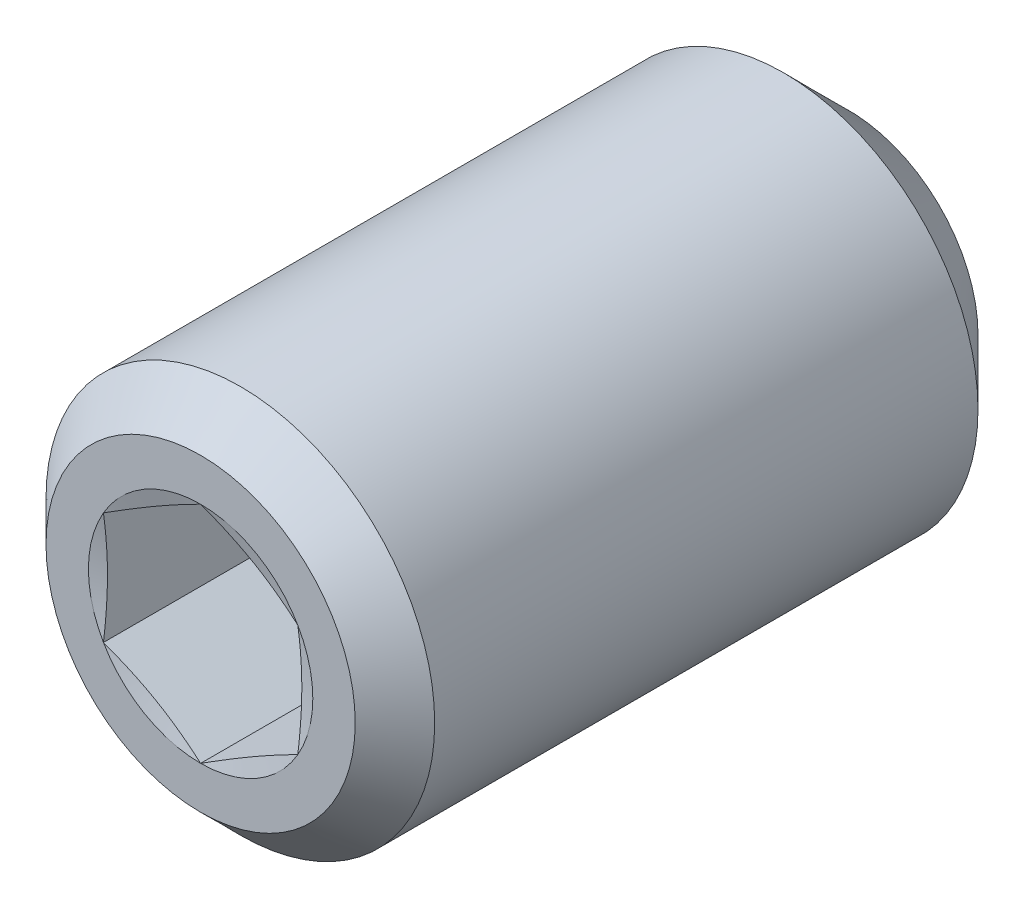
ISO-10303-21;
HEADER;
FILE_DESCRIPTION(('STEP AP214'),'2;1');
FILE_NAME('part.step','',(''),(''),'','','');
FILE_SCHEMA(('AUTOMOTIVE_DESIGN { 1 0 10303 214 1 1 1 1 }'));
ENDSEC;
DATA;
#1=APPLICATION_CONTEXT('core data for automotive mechanical design processes');
#2=APPLICATION_PROTOCOL_DEFINITION('international standard','automotive_design',2000,#1);
#3=PRODUCT_CONTEXT('',#1,'mechanical');
#4=PRODUCT('Part','Part','',(#3));
#5=PRODUCT_RELATED_PRODUCT_CATEGORY('part','',(#4));
#6=PRODUCT_DEFINITION_FORMATION('','',#4);
#7=PRODUCT_DEFINITION_CONTEXT('part definition',#1,'design');
#8=PRODUCT_DEFINITION('design','',#6,#7);
#9=PRODUCT_DEFINITION_SHAPE('','',#8);
#10=(LENGTH_UNIT() NAMED_UNIT(*) SI_UNIT(.MILLI.,.METRE.));
#11=(NAMED_UNIT(*) PLANE_ANGLE_UNIT() SI_UNIT($,.RADIAN.));
#12=(NAMED_UNIT(*) SI_UNIT($,.STERADIAN.) SOLID_ANGLE_UNIT());
#13=UNCERTAINTY_MEASURE_WITH_UNIT(LENGTH_MEASURE(1.E-05),#10,'distance_accuracy_value','');
#14=(GEOMETRIC_REPRESENTATION_CONTEXT(3) GLOBAL_UNCERTAINTY_ASSIGNED_CONTEXT((#13)) GLOBAL_UNIT_ASSIGNED_CONTEXT((#10,
#11,#12)) REPRESENTATION_CONTEXT('',''));
#15=CARTESIAN_POINT('',(0.,0.,0.));
#16=DIRECTION('',(0.,0.,1.));
#17=DIRECTION('',(1.,0.,0.));
#18=AXIS2_PLACEMENT_3D('',#15,#16,#17);
#19=CARTESIAN_POINT('',(0.,0.75,0.));
#20=DIRECTION('',(0.,0.,-1.));
#21=DIRECTION('',(-1.,0.,0.));
#22=AXIS2_PLACEMENT_3D('',#19,#20,#21);
#23=PLANE('',#22);
#24=CARTESIAN_POINT('',(0.,0.,0.));
#25=DIRECTION('',(0.,0.,1.));
#26=DIRECTION('',(1.,0.,0.));
#27=AXIS2_PLACEMENT_3D('',#24,#25,#26);
#28=CIRCLE('',#27,0.866025403784439);
#29=CARTESIAN_POINT('',(-0.75,-0.43301270189222,0.));
#30=VERTEX_POINT('',#29);
#31=CARTESIAN_POINT('',(0.,-0.866025403784439,0.));
#32=VERTEX_POINT('',#31);
#33=EDGE_CURVE('E156',#30,#32,#28,.T.);
#34=ORIENTED_EDGE('',*,*,#33,.F.);
#35=CARTESIAN_POINT('',(-0.75,0.433012701892219,0.));
#36=VERTEX_POINT('',#35);
#37=EDGE_CURVE('E155',#36,#30,#28,.T.);
#38=ORIENTED_EDGE('',*,*,#37,.F.);
#39=CARTESIAN_POINT('',(0.,0.866025403784439,0.));
#40=VERTEX_POINT('',#39);
#41=EDGE_CURVE('E121',#40,#36,#28,.T.);
#42=ORIENTED_EDGE('',*,*,#41,.F.);
#43=CARTESIAN_POINT('',(0.75,0.433012701892221,0.));
#44=VERTEX_POINT('',#43);
#45=EDGE_CURVE('E115',#44,#40,#28,.T.);
#46=ORIENTED_EDGE('',*,*,#45,.F.);
#47=CARTESIAN_POINT('',(0.75,-0.43301270189222,0.));
#48=VERTEX_POINT('',#47);
#49=EDGE_CURVE('E123',#48,#44,#28,.T.);
#50=ORIENTED_EDGE('',*,*,#49,.F.);
#51=EDGE_CURVE('E340',#32,#48,#28,.T.);
#52=ORIENTED_EDGE('',*,*,#51,.F.);
#53=EDGE_LOOP('',(#34,#38,#42,#46,#50,#52));
#54=FACE_BOUND('',#53,.T.);
#55=CARTESIAN_POINT('',(0.,0.,0.));
#56=DIRECTION('',(0.,0.,1.));
#57=DIRECTION('',(1.,0.,0.));
#58=AXIS2_PLACEMENT_3D('',#55,#56,#57);
#59=CIRCLE('',#58,1.1933);
#60=CARTESIAN_POINT('',(1.1933,0.,0.));
#61=VERTEX_POINT('',#60);
#62=EDGE_CURVE('E51',#61,#61,#59,.T.);
#63=ORIENTED_EDGE('',*,*,#62,.T.);
#64=EDGE_LOOP('',(#63));
#65=FACE_BOUND('',#64,.T.);
#66=ADVANCED_FACE('F38',(#54,#65),#23,.F.);
#67=CARTESIAN_POINT('',(0.,0.,-0.306699999999999));
#68=DIRECTION('',(0.,0.,-1.));
#69=DIRECTION('',(-1.,0.,0.));
#70=AXIS2_PLACEMENT_3D('',#67,#68,#69);
#71=CONICAL_SURFACE('',#70,1.5,0.78539816339745);
#72=ORIENTED_EDGE('',*,*,#62,.F.);
#73=EDGE_LOOP('',(#72));
#74=FACE_BOUND('',#73,.T.);
#75=CARTESIAN_POINT('',(0.,0.,-0.306699999999999));
#76=DIRECTION('',(0.,0.,1.));
#77=DIRECTION('',(1.,0.,0.));
#78=AXIS2_PLACEMENT_3D('',#75,#76,#77);
#79=CIRCLE('',#78,1.5);
#80=CARTESIAN_POINT('',(1.5,0.,-0.306699999999999));
#81=VERTEX_POINT('',#80);
#82=EDGE_CURVE('E304',#81,#81,#79,.T.);
#83=ORIENTED_EDGE('',*,*,#82,.T.);
#84=EDGE_LOOP('',(#83));
#85=FACE_BOUND('',#84,.T.);
#86=ADVANCED_FACE('F220',(#74,#85),#71,.T.);
#87=CARTESIAN_POINT('',(0.,0.,0.));
#88=DIRECTION('',(0.,0.,1.));
#89=DIRECTION('',(1.,0.,0.));
#90=AXIS2_PLACEMENT_3D('',#87,#88,#89);
#91=CYLINDRICAL_SURFACE('',#90,1.5);
#92=ORIENTED_EDGE('',*,*,#82,.F.);
#93=EDGE_LOOP('',(#92));
#94=FACE_BOUND('',#93,.T.);
#95=CARTESIAN_POINT('',(0.,0.,-4.5));
#96=DIRECTION('',(0.,0.,1.));
#97=DIRECTION('',(1.,0.,0.));
#98=AXIS2_PLACEMENT_3D('',#95,#96,#97);
#99=CIRCLE('',#98,1.5);
#100=CARTESIAN_POINT('',(1.5,0.,-4.5));
#101=VERTEX_POINT('',#100);
#102=EDGE_CURVE('E301',#101,#101,#99,.T.);
#103=ORIENTED_EDGE('',*,*,#102,.T.);
#104=EDGE_LOOP('',(#103));
#105=FACE_BOUND('',#104,.T.);
#106=ADVANCED_FACE('F224',(#94,#105),#91,.T.);
#107=CARTESIAN_POINT('',(0.,0.,-5.));
#108=DIRECTION('',(0.,0.,1.));
#109=DIRECTION('',(1.,0.,0.));
#110=AXIS2_PLACEMENT_3D('',#107,#108,#109);
#111=CONICAL_SURFACE('',#110,1.,0.785398163397448);
#112=ORIENTED_EDGE('',*,*,#102,.F.);
#113=EDGE_LOOP('',(#112));
#114=FACE_BOUND('',#113,.T.);
#115=CARTESIAN_POINT('',(0.,0.,-5.));
#116=DIRECTION('',(0.,0.,1.));
#117=DIRECTION('',(1.,0.,0.));
#118=AXIS2_PLACEMENT_3D('',#115,#116,#117);
#119=CIRCLE('',#118,1.);
#120=CARTESIAN_POINT('',(1.,0.,-5.));
#121=VERTEX_POINT('',#120);
#122=EDGE_CURVE('E296',#121,#121,#119,.T.);
#123=ORIENTED_EDGE('',*,*,#122,.T.);
#124=EDGE_LOOP('',(#123));
#125=FACE_BOUND('',#124,.T.);
#126=ADVANCED_FACE('F229',(#114,#125),#111,.T.);
#127=CARTESIAN_POINT('',(0.,1.,-5.));
#128=DIRECTION('',(0.,0.,1.));
#129=DIRECTION('',(1.,0.,0.));
#130=AXIS2_PLACEMENT_3D('',#127,#128,#129);
#131=PLANE('',#130);
#132=ORIENTED_EDGE('',*,*,#122,.F.);
#133=EDGE_LOOP('',(#132));
#134=FACE_BOUND('',#133,.T.);
#135=ADVANCED_FACE('F237',(#134),#131,.F.);
#136=CARTESIAN_POINT('',(0.,0.,-0.0310889132455345));
#137=DIRECTION('',(0.,0.,1.));
#138=DIRECTION('',(1.,0.,0.));
#139=AXIS2_PLACEMENT_3D('',#136,#137,#138);
#140=CONICAL_SURFACE('',#139,0.75,1.30899693899575);
#141=ORIENTED_EDGE('',*,*,#41,.T.);
#142=CARTESIAN_POINT('',(-0.7502,0.432897231838382,3.09462948722955E-05));
#143=CARTESIAN_POINT('',(-0.719037840271989,0.450888713145879,-0.00479360311149052));
#144=CARTESIAN_POINT('',(-0.687819151238554,0.46891283166308,-0.00917362250903638));
#145=CARTESIAN_POINT('',(-0.625271438524168,0.505024770435926,-0.0168690566741957));
#146=CARTESIAN_POINT('',(-0.593942375178671,0.523112613591908,-0.0201840383063054));
#147=CARTESIAN_POINT('',(-0.53136401188606,0.559242248484343,-0.0255557361470388));
#148=CARTESIAN_POINT('',(-0.5001151357921,0.577283795509064,-0.0276188631563584));
#149=CARTESIAN_POINT('',(-0.437577500528089,0.613389916063223,-0.0303853199406949));
#150=CARTESIAN_POINT('',(-0.406288750264044,0.631454484450776,-0.0310889132455345));
#151=CARTESIAN_POINT('',(-0.343711249735955,0.667583621225882,-0.0310889132455345));
#152=CARTESIAN_POINT('',(-0.312422499471911,0.685648189613435,-0.0303853199406949));
#153=CARTESIAN_POINT('',(-0.2498848642079,0.721754310167595,-0.0276188631563584));
#154=CARTESIAN_POINT('',(-0.21863598811394,0.739795857192316,-0.0255557361470388));
#155=CARTESIAN_POINT('',(-0.156057624821329,0.775925492084751,-0.0201840383063053));
#156=CARTESIAN_POINT('',(-0.124728561475832,0.794013335240732,-0.0168690566741957));
#157=CARTESIAN_POINT('',(-0.0621808487614456,0.830125274013579,-0.00917362250903635));
#158=CARTESIAN_POINT('',(-0.0309621597280111,0.84814939253078,-0.00479360311149048));
#159=CARTESIAN_POINT('',(0.000200000000000067,0.866140873838277,3.09462948723408E-05));
#160=B_SPLINE_CURVE_WITH_KNOTS('',3,(#142,#143,#144,#145,#146,#147,#148,#149,#150,#151,#152,
#153,#154,#155,#156,#157,#158,#159),.UNSPECIFIED.,.F.,.F.,(4,2,2,2,2,2,2,2,4),(0.,
0.108920587259312,0.217885415043552,0.326287413293608,0.434668396966266,0.543049380638924,
0.651451378888981,0.760416206673221,0.869336793932533),.UNSPECIFIED.);
#161=EDGE_CURVE('E11',#36,#40,#160,.T.);
#162=ORIENTED_EDGE('',*,*,#161,.T.);
#163=EDGE_LOOP('',(#141,#162));
#164=FACE_BOUND('',#163,.T.);
#165=ADVANCED_FACE('F127',(#164),#140,.F.);
#166=CARTESIAN_POINT('',(-0.75,-1.14482258623613,0.134669625246679));
#167=CARTESIAN_POINT('',(-0.75,-1.07678185164575,0.119460916934509));
#168=CARTESIAN_POINT('',(-0.75,-1.00866186993933,0.104564139677018));
#169=CARTESIAN_POINT('',(-0.75,-0.872108780270126,0.0759343556155119));
#170=CARTESIAN_POINT('',(-0.75,-0.803675428468903,0.0622025196192104));
#171=CARTESIAN_POINT('',(-0.75,-0.667024328389677,0.036577806672853));
#172=CARTESIAN_POINT('',(-0.75,-0.598809231475783,0.0246711034130509));
#173=CARTESIAN_POINT('',(-0.75,-0.461968565078348,0.00349957725576412));
#174=CARTESIAN_POINT('',(-0.75,-0.39334306917455,-0.0057657055287068));
#175=CARTESIAN_POINT('',(-0.75,-0.254874387193196,-0.0204880637590049));
#176=CARTESIAN_POINT('',(-0.75,-0.185026204144042,-0.0259009217168572));
#177=CARTESIAN_POINT('',(-0.75,-0.0451386456006471,-0.031572823328204));
#178=CARTESIAN_POINT('',(-0.75,0.0249006157145767,-0.0318344646143008));
#179=CARTESIAN_POINT('',(-0.75,0.165046593870639,-0.0271336726580644));
#180=CARTESIAN_POINT('',(-0.75,0.235152611190908,-0.0221520199445758));
#181=CARTESIAN_POINT('',(-0.75,0.374971381665316,-0.0080496439068817));
#182=CARTESIAN_POINT('',(-0.75,0.444683810838038,0.00107409444110468));
#183=CARTESIAN_POINT('',(-0.75,0.57900664470664,0.0214252947723858));
#184=CARTESIAN_POINT('',(-0.75,0.643645711070564,0.0324706666633663));
#185=CARTESIAN_POINT('',(-0.75,0.772626203639038,0.0561976243366958));
#186=CARTESIAN_POINT('',(-0.75,0.836967591207446,0.0688794166647535));
#187=CARTESIAN_POINT('',(-0.75,0.96543538187879,0.0953387697110075));
#188=CARTESIAN_POINT('',(-0.75,1.02956173962238,0.109116548118427));
#189=CARTESIAN_POINT('',(-0.75,1.15764916486959,0.137422879220211));
#190=CARTESIAN_POINT('',(-0.75,1.22161022807931,0.151951451216337));
#191=CARTESIAN_POINT('',(-0.75,1.41205284321498,0.196019971996214));
#192=CARTESIAN_POINT('',(-0.75,1.53835925197156,0.226314183405895));
#193=CARTESIAN_POINT('',(-0.75,1.72754301618681,0.272539035787116));
#194=CARTESIAN_POINT('',(-0.75,1.79052001268668,0.28806821024875));
#195=CARTESIAN_POINT('',(-0.75,1.91641912521064,0.319338785610066));
#196=CARTESIAN_POINT('',(-0.75,1.97934124297332,0.335080179505711));
#197=CARTESIAN_POINT('',(-0.75,2.04224365999308,0.350900921516615));
#198=B_SPLINE_CURVE_WITH_KNOTS('',3,(#166,#167,#168,#169,#170,#171,#172,#173,#174,#175,#176,
#177,#178,#179,#180,#181,#182,#183,#184,#185,#186,#187,#188,#189,#190,#191,#192,#193,#194,#195,
#196,#197),.UNSPECIFIED.,.F.,.F.,(4,2,2,2,2,2,2,2,2,2,2,2,2,2,2,4),(0.,0.209172832960231,
0.418553461255022,0.626259888239563,0.833930130186138,1.04394713172849,1.2538582241185,
1.46454144122955,1.67537826112991,1.87207734374703,2.06880127765738,2.26556438371338,
2.46233255076827,2.85198678875997,3.04657695287832,3.24116071043612),.UNSPECIFIED.);
#199=EDGE_CURVE('E120',#30,#36,#198,.T.);
#200=ORIENTED_EDGE('',*,*,#199,.T.);
#201=ORIENTED_EDGE('',*,*,#37,.T.);
#202=EDGE_LOOP('',(#200,#201));
#203=FACE_BOUND('',#202,.T.);
#204=ADVANCED_FACE('F353',(#203),#140,.F.);
#205=CARTESIAN_POINT('',(0.000199999999999855,-0.866140873838277,3.09462948723064E-05));
#206=CARTESIAN_POINT('',(-0.0309621597280113,-0.848149392530779,-0.00479360311149048));
#207=CARTESIAN_POINT('',(-0.0621808487614458,-0.830125274013579,-0.00917362250903636));
#208=CARTESIAN_POINT('',(-0.124728561475833,-0.794013335240732,-0.0168690566741957));
#209=CARTESIAN_POINT('',(-0.15605762482133,-0.775925492084751,-0.0201840383063054));
#210=CARTESIAN_POINT('',(-0.218635988113941,-0.739795857192315,-0.0255557361470388));
#211=CARTESIAN_POINT('',(-0.2498848642079,-0.721754310167595,-0.0276188631563584));
#212=CARTESIAN_POINT('',(-0.312422499471911,-0.685648189613435,-0.0303853199406949));
#213=CARTESIAN_POINT('',(-0.343711249735956,-0.667583621225882,-0.0310889132455345));
#214=CARTESIAN_POINT('',(-0.406288750264045,-0.631454484450776,-0.0310889132455345));
#215=CARTESIAN_POINT('',(-0.437577500528089,-0.613389916063223,-0.0303853199406949));
#216=CARTESIAN_POINT('',(-0.5001151357921,-0.577283795509064,-0.0276188631563584));
#217=CARTESIAN_POINT('',(-0.53136401188606,-0.559242248484343,-0.0255557361470388));
#218=CARTESIAN_POINT('',(-0.593942375178671,-0.523112613591908,-0.0201840383063054));
#219=CARTESIAN_POINT('',(-0.625271438524167,-0.505024770435926,-0.0168690566741957));
#220=CARTESIAN_POINT('',(-0.687819151238554,-0.468912831663079,-0.0091736225090364));
#221=CARTESIAN_POINT('',(-0.719037840271989,-0.450888713145879,-0.00479360311149054));
#222=CARTESIAN_POINT('',(-0.7502,-0.432897231838381,3.09462948722653E-05));
#223=B_SPLINE_CURVE_WITH_KNOTS('',3,(#205,#206,#207,#208,#209,#210,#211,#212,#213,#214,#215,
#216,#217,#218,#219,#220,#221,#222),.UNSPECIFIED.,.F.,.F.,(4,2,2,2,2,2,2,2,4),(0.,
0.108920587259312,0.217885415043551,0.326287413293608,0.434668396966266,0.543049380638924,
0.651451378888981,0.760416206673221,0.869336793932533),.UNSPECIFIED.);
#224=EDGE_CURVE('E164',#32,#30,#223,.T.);
#225=ORIENTED_EDGE('',*,*,#224,.T.);
#226=ORIENTED_EDGE('',*,*,#33,.T.);
#227=EDGE_LOOP('',(#225,#226));
#228=FACE_BOUND('',#227,.T.);
#229=ADVANCED_FACE('F344',(#228),#140,.F.);
#230=CARTESIAN_POINT('',(0.7502,-0.432897231838382,3.09462948722924E-05));
#231=CARTESIAN_POINT('',(0.719037840271989,-0.450888713145879,-0.0047936031114905));
#232=CARTESIAN_POINT('',(0.687819151238554,-0.46891283166308,-0.00917362250903637));
#233=CARTESIAN_POINT('',(0.625271438524167,-0.505024770435927,-0.0168690566741957));
#234=CARTESIAN_POINT('',(0.59394237517867,-0.523112613591908,-0.0201840383063053));
#235=CARTESIAN_POINT('',(0.531364011886059,-0.559242248484343,-0.0255557361470388));
#236=CARTESIAN_POINT('',(0.5001151357921,-0.577283795509064,-0.0276188631563584));
#237=CARTESIAN_POINT('',(0.437577500528089,-0.613389916063223,-0.0303853199406949));
#238=CARTESIAN_POINT('',(0.406288750264044,-0.631454484450776,-0.0310889132455344));
#239=CARTESIAN_POINT('',(0.343711249735955,-0.667583621225883,-0.0310889132455344));
#240=CARTESIAN_POINT('',(0.312422499471911,-0.685648189613436,-0.0303853199406949));
#241=CARTESIAN_POINT('',(0.2498848642079,-0.721754310167595,-0.0276188631563584));
#242=CARTESIAN_POINT('',(0.21863598811394,-0.739795857192316,-0.0255557361470388));
#243=CARTESIAN_POINT('',(0.156057624821329,-0.775925492084751,-0.0201840383063053));
#244=CARTESIAN_POINT('',(0.124728561475832,-0.794013335240732,-0.0168690566741957));
#245=CARTESIAN_POINT('',(0.0621808487614454,-0.830125274013579,-0.00917362250903631));
#246=CARTESIAN_POINT('',(0.0309621597280108,-0.84814939253078,-0.00479360311149044));
#247=CARTESIAN_POINT('',(-0.00020000000000023,-0.866140873838277,3.09462948723442E-05));
#248=B_SPLINE_CURVE_WITH_KNOTS('',3,(#230,#231,#232,#233,#234,#235,#236,#237,#238,#239,#240,
#241,#242,#243,#244,#245,#246,#247),.UNSPECIFIED.,.F.,.F.,(4,2,2,2,2,2,2,2,4),(0.,
0.108920587259311,0.217885415043551,0.326287413293608,0.434668396966266,0.543049380638924,
0.651451378888981,0.760416206673221,0.869336793932532),.UNSPECIFIED.);
#249=EDGE_CURVE('E185',#48,#32,#248,.T.);
#250=ORIENTED_EDGE('',*,*,#249,.T.);
#251=ORIENTED_EDGE('',*,*,#51,.T.);
#252=EDGE_LOOP('',(#250,#251));
#253=FACE_BOUND('',#252,.T.);
#254=ADVANCED_FACE('F347',(#253),#140,.F.);
#255=CARTESIAN_POINT('',(0.75,-1.14482266306326,0.134669642466261));
#256=CARTESIAN_POINT('',(0.75,-1.0767819222614,0.119460932464624));
#257=CARTESIAN_POINT('',(0.75,-1.00866193434151,0.104564153515208));
#258=CARTESIAN_POINT('',(0.75,-0.872108832201385,0.0759343661472826));
#259=CARTESIAN_POINT('',(0.75,-0.803675474142626,0.062202528536825));
#260=CARTESIAN_POINT('',(0.75,-0.66702436167103,0.0365778125664734));
#261=CARTESIAN_POINT('',(0.75,-0.59880925862319,0.0246711078925944));
#262=CARTESIAN_POINT('',(0.75,-0.461968579892892,0.00349957926823649));
#263=CARTESIAN_POINT('',(0.75,-0.393343077790215,-0.00576570456945883));
#264=CARTESIAN_POINT('',(0.75,-0.254874382659345,-0.0204880642843832));
#265=CARTESIAN_POINT('',(0.75,-0.185026192654729,-0.0259009226317642));
#266=CARTESIAN_POINT('',(0.75,-0.0451386201937041,-0.031572823912739));
#267=CARTESIAN_POINT('',(0.75,0.0249006480836576,-0.0318344644799666));
#268=CARTESIAN_POINT('',(0.75,0.165046640103213,-0.0271336701465318));
#269=CARTESIAN_POINT('',(0.75,0.235152664324342,-0.022152015769204));
#270=CARTESIAN_POINT('',(0.75,0.374971448497296,-0.00804963597099166));
#271=CARTESIAN_POINT('',(0.75,0.444683884467515,0.00107410447489512));
#272=CARTESIAN_POINT('',(0.75,0.579006724953306,0.0214253079772582));
#273=CARTESIAN_POINT('',(0.749999999999999,0.643645791179342,0.0324706806913168));
#274=CARTESIAN_POINT('',(0.749999999999999,0.772626283503578,0.0561976397363368));
#275=CARTESIAN_POINT('',(0.749999999999999,0.836967670965656,0.068879432612883));
#276=CARTESIAN_POINT('',(0.749999999999999,0.965435461427999,0.0953387865733186));
#277=CARTESIAN_POINT('',(0.749999999999999,1.02956181906901,0.109116565345963));
#278=CARTESIAN_POINT('',(0.749999999999999,1.15764924413234,0.137422897063653));
#279=CARTESIAN_POINT('',(0.749999999999999,1.22161030726075,0.151951469310449));
#280=CARTESIAN_POINT('',(0.749999999999999,1.41205292198059,0.196019990684347));
#281=CARTESIAN_POINT('',(0.749999999999999,1.5383593304253,0.226314202328641));
#282=CARTESIAN_POINT('',(0.749999999999999,1.72754309424218,0.272539054977161));
#283=CARTESIAN_POINT('',(0.749999999999999,1.79052009064412,0.288068229519657));
#284=CARTESIAN_POINT('',(0.749999999999999,1.91641920297853,0.319338805018936));
#285=CARTESIAN_POINT('',(0.749999999999999,1.97934132064959,0.335080198971683));
#286=CARTESIAN_POINT('',(0.749999999999999,2.04224373757961,0.35090094103151));
#287=B_SPLINE_CURVE_WITH_KNOTS('',3,(#255,#256,#257,#258,#259,#260,#261,#262,#263,#264,#265,
#266,#267,#268,#269,#270,#271,#272,#273,#274,#275,#276,#277,#278,#279,#280,#281,#282,#283,#284,
#285,#286),.UNSPECIFIED.,.F.,.F.,(4,2,2,2,2,2,2,2,2,2,2,2,2,2,2,4),(0.,0.209172852253365,
0.41855349990594,0.626259945743289,0.833930206526213,1.04394722891203,1.25385834211573,
1.46454158019992,1.67537842113495,1.87207750377204,2.06880143769159,2.26556454367898,
2.46233271066339,2.85198694791251,3.04657711180368,3.24116086913639),.UNSPECIFIED.);
#288=EDGE_CURVE('E63',#44,#48,#287,.F.);
#289=ORIENTED_EDGE('',*,*,#288,.T.);
#290=ORIENTED_EDGE('',*,*,#49,.T.);
#291=EDGE_LOOP('',(#289,#290));
#292=FACE_BOUND('',#291,.T.);
#293=ADVANCED_FACE('F177',(#292),#140,.F.);
#294=CARTESIAN_POINT('',(-0.000199999999999987,0.866140873838277,3.09462948723615E-05));
#295=CARTESIAN_POINT('',(0.0309621597280111,0.84814939253078,-0.00479360311149045));
#296=CARTESIAN_POINT('',(0.0621808487614456,0.830125274013579,-0.00917362250903632));
#297=CARTESIAN_POINT('',(0.124728561475833,0.794013335240732,-0.0168690566741957));
#298=CARTESIAN_POINT('',(0.156057624821329,0.775925492084751,-0.0201840383063053));
#299=CARTESIAN_POINT('',(0.21863598811394,0.739795857192316,-0.0255557361470388));
#300=CARTESIAN_POINT('',(0.2498848642079,0.721754310167595,-0.0276188631563584));
#301=CARTESIAN_POINT('',(0.312422499471911,0.685648189613436,-0.0303853199406949));
#302=CARTESIAN_POINT('',(0.343711249735955,0.667583621225883,-0.0310889132455345));
#303=CARTESIAN_POINT('',(0.406288750264044,0.631454484450776,-0.0310889132455344));
#304=CARTESIAN_POINT('',(0.437577500528089,0.613389916063223,-0.0303853199406949));
#305=CARTESIAN_POINT('',(0.5001151357921,0.577283795509064,-0.0276188631563584));
#306=CARTESIAN_POINT('',(0.531364011886059,0.559242248484343,-0.0255557361470388));
#307=CARTESIAN_POINT('',(0.59394237517867,0.523112613591908,-0.0201840383063054));
#308=CARTESIAN_POINT('',(0.625271438524167,0.505024770435927,-0.0168690566741957));
#309=CARTESIAN_POINT('',(0.687819151238554,0.46891283166308,-0.00917362250903637));
#310=CARTESIAN_POINT('',(0.719037840271989,0.450888713145879,-0.0047936031114905));
#311=CARTESIAN_POINT('',(0.7502,0.432897231838382,3.09462948722619E-05));
#312=B_SPLINE_CURVE_WITH_KNOTS('',3,(#294,#295,#296,#297,#298,#299,#300,#301,#302,#303,#304,
#305,#306,#307,#308,#309,#310,#311),.UNSPECIFIED.,.F.,.F.,(4,2,2,2,2,2,2,2,4),(0.,
0.108920587259311,0.217885415043551,0.326287413293608,0.434668396966266,0.543049380638924,
0.651451378888981,0.760416206673221,0.869336793932532),.UNSPECIFIED.);
#313=EDGE_CURVE('E57',#40,#44,#312,.T.);
#314=ORIENTED_EDGE('',*,*,#313,.T.);
#315=ORIENTED_EDGE('',*,*,#45,.T.);
#316=EDGE_LOOP('',(#314,#315));
#317=FACE_BOUND('',#316,.T.);
#318=ADVANCED_FACE('F116',(#317),#140,.F.);
#319=CARTESIAN_POINT('',(0.,0.,-1.2));
#320=DIRECTION('',(0.,0.,1.));
#321=DIRECTION('',(1.,0.,0.));
#322=AXIS2_PLACEMENT_3D('',#319,#320,#321);
#323=CONICAL_SURFACE('',#322,0.75,1.0471975511966);
#324=CARTESIAN_POINT('',(0.,0.,-1.63301270189222));
#325=VERTEX_POINT('',#324);
#326=VERTEX_LOOP('',#325);
#327=FACE_BOUND('',#326,.T.);
#328=CARTESIAN_POINT('',(0.,0.,-1.2));
#329=DIRECTION('',(0.,0.,1.));
#330=DIRECTION('',(1.,0.,0.));
#331=AXIS2_PLACEMENT_3D('',#328,#329,#330);
#332=CIRCLE('',#331,0.75);
#333=CARTESIAN_POINT('',(0.75,0.,-1.2));
#334=VERTEX_POINT('',#333);
#335=CARTESIAN_POINT('',(0.375,0.649519052838329,-1.2));
#336=VERTEX_POINT('',#335);
#337=EDGE_CURVE('E294',#334,#336,#332,.T.);
#338=ORIENTED_EDGE('',*,*,#337,.T.);
#339=CARTESIAN_POINT('',(-0.375,0.649519052838329,-1.2));
#340=VERTEX_POINT('',#339);
#341=EDGE_CURVE('E293',#336,#340,#332,.T.);
#342=ORIENTED_EDGE('',*,*,#341,.T.);
#343=CARTESIAN_POINT('',(-0.75,0.,-1.2));
#344=VERTEX_POINT('',#343);
#345=EDGE_CURVE('E278',#340,#344,#332,.T.);
#346=ORIENTED_EDGE('',*,*,#345,.T.);
#347=CARTESIAN_POINT('',(-0.375,-0.649519052838329,-1.2));
#348=VERTEX_POINT('',#347);
#349=EDGE_CURVE('E269',#344,#348,#332,.T.);
#350=ORIENTED_EDGE('',*,*,#349,.T.);
#351=CARTESIAN_POINT('',(0.375,-0.649519052838329,-1.2));
#352=VERTEX_POINT('',#351);
#353=EDGE_CURVE('E279',#348,#352,#332,.T.);
#354=ORIENTED_EDGE('',*,*,#353,.T.);
#355=EDGE_CURVE('E297',#352,#334,#332,.T.);
#356=ORIENTED_EDGE('',*,*,#355,.T.);
#357=EDGE_LOOP('',(#338,#342,#346,#350,#354,#356));
#358=FACE_BOUND('',#357,.T.);
#359=ADVANCED_FACE('F176',(#327,#358),#323,.F.);
#360=CARTESIAN_POINT('',(0.,0.,-1.2));
#361=DIRECTION('',(0.,0.,1.));
#362=DIRECTION('',(1.,0.,0.));
#363=AXIS2_PLACEMENT_3D('',#360,#361,#362);
#364=PLANE('',#363);
#365=ORIENTED_EDGE('',*,*,#337,.F.);
#366=DIRECTION('',(0.,1.,0.));
#367=VECTOR('',#366,1.);
#368=CARTESIAN_POINT('',(0.75,-0.43301270189222,-1.2));
#369=LINE('',#368,#367);
#370=CARTESIAN_POINT('',(0.75,0.43301270189222,-1.2));
#371=VERTEX_POINT('',#370);
#372=EDGE_CURVE('E323',#334,#371,#369,.T.);
#373=ORIENTED_EDGE('',*,*,#372,.T.);
#374=DIRECTION('',(-0.866025403784439,0.5,0.));
#375=VECTOR('',#374,1.);
#376=CARTESIAN_POINT('',(0.75,0.43301270189222,-1.2));
#377=LINE('',#376,#375);
#378=EDGE_CURVE('E329',#371,#336,#377,.T.);
#379=ORIENTED_EDGE('',*,*,#378,.T.);
#380=EDGE_LOOP('',(#365,#373,#379));
#381=FACE_BOUND('',#380,.T.);
#382=ADVANCED_FACE('F243',(#381),#364,.T.);
#383=ORIENTED_EDGE('',*,*,#355,.F.);
#384=DIRECTION('',(0.866025403784439,0.5,0.));
#385=VECTOR('',#384,1.);
#386=CARTESIAN_POINT('',(0.,-0.866025403784439,-1.2));
#387=LINE('',#386,#385);
#388=CARTESIAN_POINT('',(0.75,-0.43301270189222,-1.2));
#389=VERTEX_POINT('',#388);
#390=EDGE_CURVE('E327',#352,#389,#387,.T.);
#391=ORIENTED_EDGE('',*,*,#390,.T.);
#392=EDGE_CURVE('E150',#389,#334,#369,.T.);
#393=ORIENTED_EDGE('',*,*,#392,.T.);
#394=EDGE_LOOP('',(#383,#391,#393));
#395=FACE_BOUND('',#394,.T.);
#396=ADVANCED_FACE('F178',(#395),#364,.T.);
#397=ORIENTED_EDGE('',*,*,#353,.F.);
#398=DIRECTION('',(0.866025403784438,-0.5,0.));
#399=VECTOR('',#398,1.);
#400=CARTESIAN_POINT('',(-0.75,-0.433012701892219,-1.2));
#401=LINE('',#400,#399);
#402=CARTESIAN_POINT('',(0.,-0.866025403784439,-1.2));
#403=VERTEX_POINT('',#402);
#404=EDGE_CURVE('E289',#348,#403,#401,.T.);
#405=ORIENTED_EDGE('',*,*,#404,.T.);
#406=EDGE_CURVE('E324',#403,#352,#387,.T.);
#407=ORIENTED_EDGE('',*,*,#406,.T.);
#408=EDGE_LOOP('',(#397,#405,#407));
#409=FACE_BOUND('',#408,.T.);
#410=ADVANCED_FACE('F261',(#409),#364,.T.);
#411=ORIENTED_EDGE('',*,*,#349,.F.);
#412=DIRECTION('',(0.,-1.,0.));
#413=VECTOR('',#412,1.);
#414=CARTESIAN_POINT('',(-0.75,0.433012701892219,-1.2));
#415=LINE('',#414,#413);
#416=CARTESIAN_POINT('',(-0.75,-0.433012701892219,-1.2));
#417=VERTEX_POINT('',#416);
#418=EDGE_CURVE('E271',#344,#417,#415,.T.);
#419=ORIENTED_EDGE('',*,*,#418,.T.);
#420=EDGE_CURVE('E274',#417,#348,#401,.T.);
#421=ORIENTED_EDGE('',*,*,#420,.T.);
#422=EDGE_LOOP('',(#411,#419,#421));
#423=FACE_BOUND('',#422,.T.);
#424=ADVANCED_FACE('F255',(#423),#364,.T.);
#425=ORIENTED_EDGE('',*,*,#341,.F.);
#426=CARTESIAN_POINT('',(0.,0.866025403784439,-1.2));
#427=VERTEX_POINT('',#426);
#428=EDGE_CURVE('E143',#336,#427,#377,.T.);
#429=ORIENTED_EDGE('',*,*,#428,.T.);
#430=DIRECTION('',(-0.866025403784439,-0.5,0.));
#431=VECTOR('',#430,1.);
#432=CARTESIAN_POINT('',(0.,0.866025403784439,-1.2));
#433=LINE('',#432,#431);
#434=EDGE_CURVE('E148',#427,#340,#433,.T.);
#435=ORIENTED_EDGE('',*,*,#434,.T.);
#436=EDGE_LOOP('',(#425,#429,#435));
#437=FACE_BOUND('',#436,.T.);
#438=ADVANCED_FACE('F253',(#437),#364,.T.);
#439=ORIENTED_EDGE('',*,*,#345,.F.);
#440=CARTESIAN_POINT('',(-0.75,0.433012701892219,-1.2));
#441=VERTEX_POINT('',#440);
#442=EDGE_CURVE('E288',#340,#441,#433,.T.);
#443=ORIENTED_EDGE('',*,*,#442,.T.);
#444=EDGE_CURVE('E284',#441,#344,#415,.T.);
#445=ORIENTED_EDGE('',*,*,#444,.T.);
#446=EDGE_LOOP('',(#439,#443,#445));
#447=FACE_BOUND('',#446,.T.);
#448=ADVANCED_FACE('F249',(#447),#364,.T.);
#449=CARTESIAN_POINT('',(0.,0.866025403784439,-1.2));
#450=DIRECTION('',(-0.5,0.866025403784439,0.));
#451=DIRECTION('',(-0.866025403784439,-0.5,0.));
#452=AXIS2_PLACEMENT_3D('',#449,#450,#451);
#453=PLANE('',#452);
#454=ORIENTED_EDGE('',*,*,#161,.F.);
#455=DIRECTION('',(0.,0.,1.));
#456=VECTOR('',#455,1.);
#457=CARTESIAN_POINT('',(-0.75,0.433012701892219,-1.2));
#458=LINE('',#457,#456);
#459=EDGE_CURVE('E149',#441,#36,#458,.T.);
#460=ORIENTED_EDGE('',*,*,#459,.F.);
#461=ORIENTED_EDGE('',*,*,#442,.F.);
#462=ORIENTED_EDGE('',*,*,#434,.F.);
#463=DIRECTION('',(0.,0.,1.));
#464=VECTOR('',#463,1.);
#465=CARTESIAN_POINT('',(0.,0.866025403784439,-1.2));
#466=LINE('',#465,#464);
#467=EDGE_CURVE('E138',#427,#40,#466,.T.);
#468=ORIENTED_EDGE('',*,*,#467,.T.);
#469=EDGE_LOOP('',(#454,#460,#461,#462,#468));
#470=FACE_BOUND('',#469,.T.);
#471=ADVANCED_FACE('F145',(#470),#453,.F.);
#472=CARTESIAN_POINT('',(-0.75,0.433012701892219,-1.2));
#473=DIRECTION('',(-1.,0.,0.));
#474=DIRECTION('',(0.,0.,1.));
#475=AXIS2_PLACEMENT_3D('',#472,#473,#474);
#476=PLANE('',#475);
#477=ORIENTED_EDGE('',*,*,#199,.F.);
#478=DIRECTION('',(0.,0.,1.));
#479=VECTOR('',#478,1.);
#480=CARTESIAN_POINT('',(-0.75,-0.433012701892219,-1.2));
#481=LINE('',#480,#479);
#482=EDGE_CURVE('E286',#417,#30,#481,.T.);
#483=ORIENTED_EDGE('',*,*,#482,.F.);
#484=ORIENTED_EDGE('',*,*,#418,.F.);
#485=ORIENTED_EDGE('',*,*,#444,.F.);
#486=ORIENTED_EDGE('',*,*,#459,.T.);
#487=EDGE_LOOP('',(#477,#483,#484,#485,#486));
#488=FACE_BOUND('',#487,.T.);
#489=ADVANCED_FACE('F171',(#488),#476,.F.);
#490=CARTESIAN_POINT('',(-0.75,-0.433012701892219,-1.2));
#491=DIRECTION('',(-0.5,-0.866025403784438,0.));
#492=DIRECTION('',(0.866025403784439,-0.5,0.));
#493=AXIS2_PLACEMENT_3D('',#490,#491,#492);
#494=PLANE('',#493);
#495=ORIENTED_EDGE('',*,*,#224,.F.);
#496=DIRECTION('',(0.,0.,1.));
#497=VECTOR('',#496,1.);
#498=CARTESIAN_POINT('',(0.,-0.866025403784439,-1.2));
#499=LINE('',#498,#497);
#500=EDGE_CURVE('E314',#403,#32,#499,.T.);
#501=ORIENTED_EDGE('',*,*,#500,.F.);
#502=ORIENTED_EDGE('',*,*,#404,.F.);
#503=ORIENTED_EDGE('',*,*,#420,.F.);
#504=ORIENTED_EDGE('',*,*,#482,.T.);
#505=EDGE_LOOP('',(#495,#501,#502,#503,#504));
#506=FACE_BOUND('',#505,.T.);
#507=ADVANCED_FACE('F209',(#506),#494,.F.);
#508=CARTESIAN_POINT('',(0.,-0.866025403784439,-1.2));
#509=DIRECTION('',(0.5,-0.866025403784439,0.));
#510=DIRECTION('',(0.866025403784439,0.5,0.));
#511=AXIS2_PLACEMENT_3D('',#508,#509,#510);
#512=PLANE('',#511);
#513=ORIENTED_EDGE('',*,*,#249,.F.);
#514=DIRECTION('',(0.,0.,1.));
#515=VECTOR('',#514,1.);
#516=CARTESIAN_POINT('',(0.75,-0.43301270189222,-1.2));
#517=LINE('',#516,#515);
#518=EDGE_CURVE('E317',#389,#48,#517,.T.);
#519=ORIENTED_EDGE('',*,*,#518,.F.);
#520=ORIENTED_EDGE('',*,*,#390,.F.);
#521=ORIENTED_EDGE('',*,*,#406,.F.);
#522=ORIENTED_EDGE('',*,*,#500,.T.);
#523=EDGE_LOOP('',(#513,#519,#520,#521,#522));
#524=FACE_BOUND('',#523,.T.);
#525=ADVANCED_FACE('F205',(#524),#512,.F.);
#526=CARTESIAN_POINT('',(0.75,-0.43301270189222,-1.2));
#527=DIRECTION('',(1.,0.,0.));
#528=DIRECTION('',(0.,1.,0.));
#529=AXIS2_PLACEMENT_3D('',#526,#527,#528);
#530=PLANE('',#529);
#531=ORIENTED_EDGE('',*,*,#288,.F.);
#532=DIRECTION('',(0.,0.,1.));
#533=VECTOR('',#532,1.);
#534=CARTESIAN_POINT('',(0.75,0.43301270189222,-1.2));
#535=LINE('',#534,#533);
#536=EDGE_CURVE('E142',#371,#44,#535,.T.);
#537=ORIENTED_EDGE('',*,*,#536,.F.);
#538=ORIENTED_EDGE('',*,*,#372,.F.);
#539=ORIENTED_EDGE('',*,*,#392,.F.);
#540=ORIENTED_EDGE('',*,*,#518,.T.);
#541=EDGE_LOOP('',(#531,#537,#538,#539,#540));
#542=FACE_BOUND('',#541,.T.);
#543=ADVANCED_FACE('F202',(#542),#530,.F.);
#544=CARTESIAN_POINT('',(0.75,0.43301270189222,-1.2));
#545=DIRECTION('',(0.5,0.866025403784439,0.));
#546=DIRECTION('',(-0.866025403784439,0.5,0.));
#547=AXIS2_PLACEMENT_3D('',#544,#545,#546);
#548=PLANE('',#547);
#549=ORIENTED_EDGE('',*,*,#313,.F.);
#550=ORIENTED_EDGE('',*,*,#467,.F.);
#551=ORIENTED_EDGE('',*,*,#428,.F.);
#552=ORIENTED_EDGE('',*,*,#378,.F.);
#553=ORIENTED_EDGE('',*,*,#536,.T.);
#554=EDGE_LOOP('',(#549,#550,#551,#552,#553));
#555=FACE_BOUND('',#554,.T.);
#556=ADVANCED_FACE('F136',(#555),#548,.F.);
#557=CLOSED_SHELL('',(#66,#86,#106,#126,#135,#165,#204,#229,#254,#293,#318,#359,#382,#396,#410,
#424,#438,#448,#471,#489,#507,#525,#543,#556));
#558=MANIFOLD_SOLID_BREP('B2',#557);
#559=ADVANCED_BREP_SHAPE_REPRESENTATION('',(#18,#558),#14);
#560=SHAPE_DEFINITION_REPRESENTATION(#9,#559);
ENDSEC;
END-ISO-10303-21;
